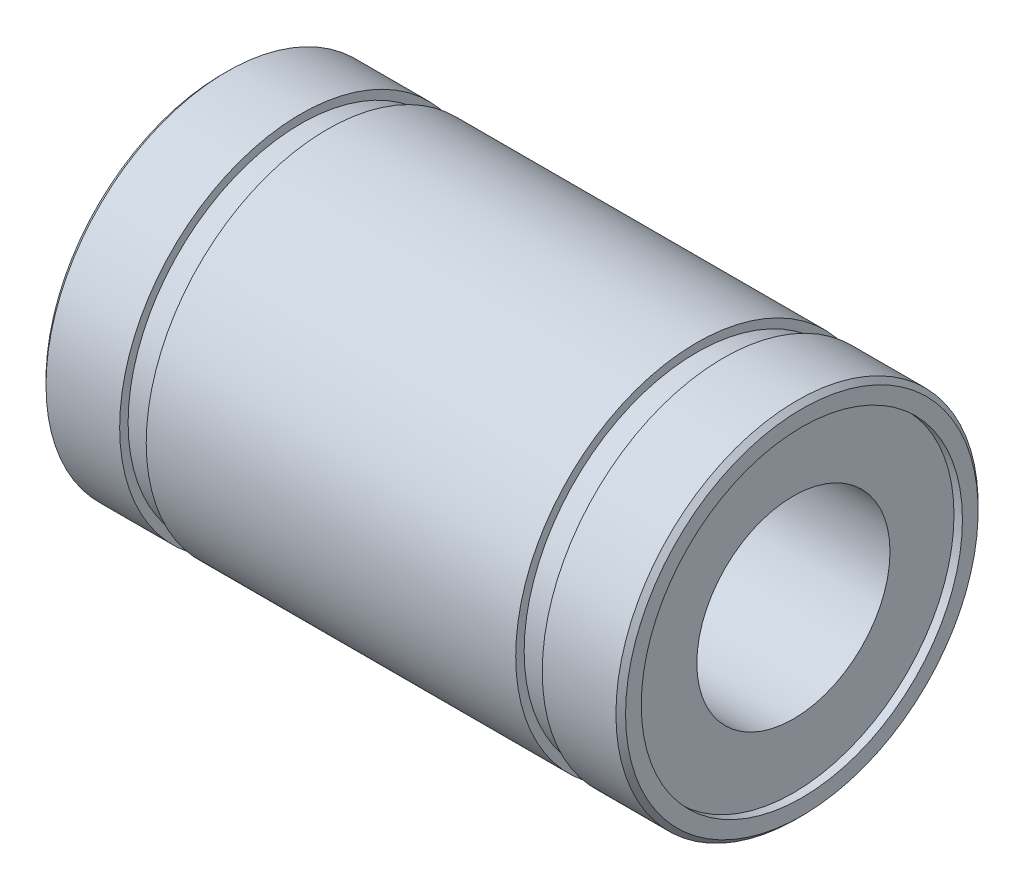
ISO-10303-21;
HEADER;
FILE_DESCRIPTION(('STEP AP214'),'2;1');
FILE_NAME('part.step','',(''),(''),'','','');
FILE_SCHEMA(('AUTOMOTIVE_DESIGN { 1 0 10303 214 1 1 1 1 }'));
ENDSEC;
DATA;
#1=APPLICATION_CONTEXT('core data for automotive mechanical design processes');
#2=APPLICATION_PROTOCOL_DEFINITION('international standard','automotive_design',2000,#1);
#3=PRODUCT_CONTEXT('',#1,'mechanical');
#4=PRODUCT('Part','Part','',(#3));
#5=PRODUCT_RELATED_PRODUCT_CATEGORY('part','',(#4));
#6=PRODUCT_DEFINITION_FORMATION('','',#4);
#7=PRODUCT_DEFINITION_CONTEXT('part definition',#1,'design');
#8=PRODUCT_DEFINITION('design','',#6,#7);
#9=PRODUCT_DEFINITION_SHAPE('','',#8);
#10=(LENGTH_UNIT() NAMED_UNIT(*) SI_UNIT(.MILLI.,.METRE.));
#11=(NAMED_UNIT(*) PLANE_ANGLE_UNIT() SI_UNIT($,.RADIAN.));
#12=(NAMED_UNIT(*) SI_UNIT($,.STERADIAN.) SOLID_ANGLE_UNIT());
#13=UNCERTAINTY_MEASURE_WITH_UNIT(LENGTH_MEASURE(1.E-05),#10,'distance_accuracy_value','');
#14=(GEOMETRIC_REPRESENTATION_CONTEXT(3) GLOBAL_UNCERTAINTY_ASSIGNED_CONTEXT((#13)) GLOBAL_UNIT_ASSIGNED_CONTEXT((#10,
#11,#12)) REPRESENTATION_CONTEXT('',''));
#15=CARTESIAN_POINT('',(0.,0.,0.));
#16=DIRECTION('',(0.,0.,1.));
#17=DIRECTION('',(1.,0.,0.));
#18=AXIS2_PLACEMENT_3D('',#15,#16,#17);
#19=CARTESIAN_POINT('',(0.,0.,0.));
#20=DIRECTION('',(-1.,0.,0.));
#21=DIRECTION('',(0.,0.,1.));
#22=AXIS2_PLACEMENT_3D('',#19,#20,#21);
#23=CYLINDRICAL_SURFACE('',#22,4.);
#24=CARTESIAN_POINT('',(23.65,0.,0.));
#25=DIRECTION('',(-1.,0.,0.));
#26=DIRECTION('',(0.,0.,1.));
#27=AXIS2_PLACEMENT_3D('',#24,#25,#26);
#28=CIRCLE('',#27,4.);
#29=CARTESIAN_POINT('',(23.65,0.,4.));
#30=VERTEX_POINT('',#29);
#31=EDGE_CURVE('E116',#30,#30,#28,.T.);
#32=ORIENTED_EDGE('',*,*,#31,.F.);
#33=EDGE_LOOP('',(#32));
#34=FACE_BOUND('',#33,.T.);
#35=CARTESIAN_POINT('',(0.35,0.,0.));
#36=DIRECTION('',(-1.,0.,0.));
#37=DIRECTION('',(0.,0.,1.));
#38=AXIS2_PLACEMENT_3D('',#35,#36,#37);
#39=CIRCLE('',#38,4.);
#40=CARTESIAN_POINT('',(0.35,0.,4.));
#41=VERTEX_POINT('',#40);
#42=EDGE_CURVE('E66',#41,#41,#39,.T.);
#43=ORIENTED_EDGE('',*,*,#42,.T.);
#44=EDGE_LOOP('',(#43));
#45=FACE_BOUND('',#44,.T.);
#46=ADVANCED_FACE('F38',(#34,#45),#23,.F.);
#47=CARTESIAN_POINT('',(0.35,4.,0.));
#48=DIRECTION('',(1.,0.,0.));
#49=DIRECTION('',(0.,0.,-1.));
#50=AXIS2_PLACEMENT_3D('',#47,#48,#49);
#51=PLANE('',#50);
#52=ORIENTED_EDGE('',*,*,#42,.F.);
#53=EDGE_LOOP('',(#52));
#54=FACE_BOUND('',#53,.T.);
#55=CARTESIAN_POINT('',(0.35,0.,0.));
#56=DIRECTION('',(-1.,0.,0.));
#57=DIRECTION('',(0.,0.,1.));
#58=AXIS2_PLACEMENT_3D('',#55,#56,#57);
#59=CIRCLE('',#58,6.65);
#60=CARTESIAN_POINT('',(0.35,0.,6.65));
#61=VERTEX_POINT('',#60);
#62=EDGE_CURVE('E70',#61,#61,#59,.T.);
#63=ORIENTED_EDGE('',*,*,#62,.T.);
#64=EDGE_LOOP('',(#63));
#65=FACE_BOUND('',#64,.T.);
#66=ADVANCED_FACE('F124',(#54,#65),#51,.F.);
#67=CARTESIAN_POINT('',(0.,0.,0.));
#68=DIRECTION('',(-1.,0.,0.));
#69=DIRECTION('',(0.,0.,1.));
#70=AXIS2_PLACEMENT_3D('',#67,#68,#69);
#71=CYLINDRICAL_SURFACE('',#70,6.65);
#72=ORIENTED_EDGE('',*,*,#62,.F.);
#73=EDGE_LOOP('',(#72));
#74=FACE_BOUND('',#73,.T.);
#75=CARTESIAN_POINT('',(0.,0.,0.));
#76=DIRECTION('',(-1.,0.,0.));
#77=DIRECTION('',(0.,0.,1.));
#78=AXIS2_PLACEMENT_3D('',#75,#76,#77);
#79=CIRCLE('',#78,6.65);
#80=CARTESIAN_POINT('',(0.,0.,6.65));
#81=VERTEX_POINT('',#80);
#82=EDGE_CURVE('E74',#81,#81,#79,.T.);
#83=ORIENTED_EDGE('',*,*,#82,.T.);
#84=EDGE_LOOP('',(#83));
#85=FACE_BOUND('',#84,.T.);
#86=ADVANCED_FACE('F130',(#74,#85),#71,.F.);
#87=CARTESIAN_POINT('',(0.,6.65,0.));
#88=DIRECTION('',(1.,0.,0.));
#89=DIRECTION('',(0.,0.,-1.));
#90=AXIS2_PLACEMENT_3D('',#87,#88,#89);
#91=PLANE('',#90);
#92=CARTESIAN_POINT('',(0.,0.,0.));
#93=DIRECTION('',(1.,0.,0.));
#94=DIRECTION('',(0.,0.,-1.));
#95=AXIS2_PLACEMENT_3D('',#92,#93,#94);
#96=CIRCLE('',#95,7.3);
#97=CARTESIAN_POINT('',(0.,0.,-7.3));
#98=VERTEX_POINT('',#97);
#99=EDGE_CURVE('E47',#98,#98,#96,.F.);
#100=ORIENTED_EDGE('',*,*,#99,.T.);
#101=EDGE_LOOP('',(#100));
#102=FACE_BOUND('',#101,.T.);
#103=ORIENTED_EDGE('',*,*,#82,.F.);
#104=EDGE_LOOP('',(#103));
#105=FACE_BOUND('',#104,.T.);
#106=ADVANCED_FACE('F136',(#102,#105),#91,.F.);
#107=CARTESIAN_POINT('',(0.,0.,0.));
#108=DIRECTION('',(-1.,0.,0.));
#109=DIRECTION('',(0.,0.,1.));
#110=AXIS2_PLACEMENT_3D('',#107,#108,#109);
#111=CYLINDRICAL_SURFACE('',#110,7.5);
#112=CARTESIAN_POINT('',(0.199999999999997,0.,0.));
#113=DIRECTION('',(1.,0.,0.));
#114=DIRECTION('',(0.,0.,-1.));
#115=AXIS2_PLACEMENT_3D('',#112,#113,#114);
#116=CIRCLE('',#115,7.5);
#117=CARTESIAN_POINT('',(0.199999999999997,0.,-7.5));
#118=VERTEX_POINT('',#117);
#119=EDGE_CURVE('E10',#118,#118,#116,.T.);
#120=ORIENTED_EDGE('',*,*,#119,.T.);
#121=EDGE_LOOP('',(#120));
#122=FACE_BOUND('',#121,.T.);
#123=CARTESIAN_POINT('',(3.25,0.,0.));
#124=DIRECTION('',(-1.,0.,0.));
#125=DIRECTION('',(0.,0.,1.));
#126=AXIS2_PLACEMENT_3D('',#123,#124,#125);
#127=CIRCLE('',#126,7.5);
#128=CARTESIAN_POINT('',(3.25,0.,7.5));
#129=VERTEX_POINT('',#128);
#130=EDGE_CURVE('E78',#129,#129,#127,.T.);
#131=ORIENTED_EDGE('',*,*,#130,.T.);
#132=EDGE_LOOP('',(#131));
#133=FACE_BOUND('',#132,.T.);
#134=ADVANCED_FACE('F141',(#122,#133),#111,.T.);
#135=CARTESIAN_POINT('',(3.25,7.5,0.));
#136=DIRECTION('',(-1.,0.,0.));
#137=DIRECTION('',(0.,0.,1.));
#138=AXIS2_PLACEMENT_3D('',#135,#136,#137);
#139=PLANE('',#138);
#140=ORIENTED_EDGE('',*,*,#130,.F.);
#141=EDGE_LOOP('',(#140));
#142=FACE_BOUND('',#141,.T.);
#143=CARTESIAN_POINT('',(3.25,0.,0.));
#144=DIRECTION('',(-1.,0.,0.));
#145=DIRECTION('',(0.,0.,1.));
#146=AXIS2_PLACEMENT_3D('',#143,#144,#145);
#147=CIRCLE('',#146,7.15);
#148=CARTESIAN_POINT('',(3.25,0.,7.15));
#149=VERTEX_POINT('',#148);
#150=EDGE_CURVE('E82',#149,#149,#147,.T.);
#151=ORIENTED_EDGE('',*,*,#150,.T.);
#152=EDGE_LOOP('',(#151));
#153=FACE_BOUND('',#152,.T.);
#154=ADVANCED_FACE('F146',(#142,#153),#139,.F.);
#155=CARTESIAN_POINT('',(0.,0.,0.));
#156=DIRECTION('',(-1.,0.,0.));
#157=DIRECTION('',(0.,0.,1.));
#158=AXIS2_PLACEMENT_3D('',#155,#156,#157);
#159=CYLINDRICAL_SURFACE('',#158,7.15);
#160=ORIENTED_EDGE('',*,*,#150,.F.);
#161=EDGE_LOOP('',(#160));
#162=FACE_BOUND('',#161,.T.);
#163=CARTESIAN_POINT('',(4.35,0.,0.));
#164=DIRECTION('',(-1.,0.,0.));
#165=DIRECTION('',(0.,0.,1.));
#166=AXIS2_PLACEMENT_3D('',#163,#164,#165);
#167=CIRCLE('',#166,7.15);
#168=CARTESIAN_POINT('',(4.35,0.,7.15));
#169=VERTEX_POINT('',#168);
#170=EDGE_CURVE('E86',#169,#169,#167,.T.);
#171=ORIENTED_EDGE('',*,*,#170,.T.);
#172=EDGE_LOOP('',(#171));
#173=FACE_BOUND('',#172,.T.);
#174=ADVANCED_FACE('F198',(#162,#173),#159,.T.);
#175=CARTESIAN_POINT('',(4.35,7.15,0.));
#176=DIRECTION('',(1.,0.,0.));
#177=DIRECTION('',(0.,0.,-1.));
#178=AXIS2_PLACEMENT_3D('',#175,#176,#177);
#179=PLANE('',#178);
#180=ORIENTED_EDGE('',*,*,#170,.F.);
#181=EDGE_LOOP('',(#180));
#182=FACE_BOUND('',#181,.T.);
#183=CARTESIAN_POINT('',(4.35,0.,0.));
#184=DIRECTION('',(-1.,0.,0.));
#185=DIRECTION('',(0.,0.,1.));
#186=AXIS2_PLACEMENT_3D('',#183,#184,#185);
#187=CIRCLE('',#186,7.5);
#188=CARTESIAN_POINT('',(4.35,0.,7.5));
#189=VERTEX_POINT('',#188);
#190=EDGE_CURVE('E90',#189,#189,#187,.T.);
#191=ORIENTED_EDGE('',*,*,#190,.T.);
#192=EDGE_LOOP('',(#191));
#193=FACE_BOUND('',#192,.T.);
#194=ADVANCED_FACE('F194',(#182,#193),#179,.F.);
#195=CARTESIAN_POINT('',(0.,0.,0.));
#196=DIRECTION('',(-1.,0.,0.));
#197=DIRECTION('',(0.,0.,1.));
#198=AXIS2_PLACEMENT_3D('',#195,#196,#197);
#199=CYLINDRICAL_SURFACE('',#198,7.5);
#200=ORIENTED_EDGE('',*,*,#190,.F.);
#201=EDGE_LOOP('',(#200));
#202=FACE_BOUND('',#201,.T.);
#203=CARTESIAN_POINT('',(19.65,0.,0.));
#204=DIRECTION('',(-1.,0.,0.));
#205=DIRECTION('',(0.,0.,1.));
#206=AXIS2_PLACEMENT_3D('',#203,#204,#205);
#207=CIRCLE('',#206,7.5);
#208=CARTESIAN_POINT('',(19.65,0.,7.5));
#209=VERTEX_POINT('',#208);
#210=EDGE_CURVE('E94',#209,#209,#207,.T.);
#211=ORIENTED_EDGE('',*,*,#210,.T.);
#212=EDGE_LOOP('',(#211));
#213=FACE_BOUND('',#212,.T.);
#214=ADVANCED_FACE('F190',(#202,#213),#199,.T.);
#215=CARTESIAN_POINT('',(19.65,7.5,0.));
#216=DIRECTION('',(-1.,0.,0.));
#217=DIRECTION('',(0.,0.,1.));
#218=AXIS2_PLACEMENT_3D('',#215,#216,#217);
#219=PLANE('',#218);
#220=ORIENTED_EDGE('',*,*,#210,.F.);
#221=EDGE_LOOP('',(#220));
#222=FACE_BOUND('',#221,.T.);
#223=CARTESIAN_POINT('',(19.65,0.,0.));
#224=DIRECTION('',(-1.,0.,0.));
#225=DIRECTION('',(0.,0.,1.));
#226=AXIS2_PLACEMENT_3D('',#223,#224,#225);
#227=CIRCLE('',#226,7.15);
#228=CARTESIAN_POINT('',(19.65,0.,7.15));
#229=VERTEX_POINT('',#228);
#230=EDGE_CURVE('E98',#229,#229,#227,.T.);
#231=ORIENTED_EDGE('',*,*,#230,.T.);
#232=EDGE_LOOP('',(#231));
#233=FACE_BOUND('',#232,.T.);
#234=ADVANCED_FACE('F182',(#222,#233),#219,.F.);
#235=CARTESIAN_POINT('',(0.,0.,0.));
#236=DIRECTION('',(-1.,0.,0.));
#237=DIRECTION('',(0.,0.,1.));
#238=AXIS2_PLACEMENT_3D('',#235,#236,#237);
#239=CYLINDRICAL_SURFACE('',#238,7.15);
#240=ORIENTED_EDGE('',*,*,#230,.F.);
#241=EDGE_LOOP('',(#240));
#242=FACE_BOUND('',#241,.T.);
#243=CARTESIAN_POINT('',(20.75,0.,0.));
#244=DIRECTION('',(-1.,0.,0.));
#245=DIRECTION('',(0.,0.,1.));
#246=AXIS2_PLACEMENT_3D('',#243,#244,#245);
#247=CIRCLE('',#246,7.15);
#248=CARTESIAN_POINT('',(20.75,0.,7.15));
#249=VERTEX_POINT('',#248);
#250=EDGE_CURVE('E101',#249,#249,#247,.T.);
#251=ORIENTED_EDGE('',*,*,#250,.T.);
#252=EDGE_LOOP('',(#251));
#253=FACE_BOUND('',#252,.T.);
#254=ADVANCED_FACE('F176',(#242,#253),#239,.T.);
#255=CARTESIAN_POINT('',(20.75,7.15,0.));
#256=DIRECTION('',(1.,0.,0.));
#257=DIRECTION('',(0.,0.,-1.));
#258=AXIS2_PLACEMENT_3D('',#255,#256,#257);
#259=PLANE('',#258);
#260=ORIENTED_EDGE('',*,*,#250,.F.);
#261=EDGE_LOOP('',(#260));
#262=FACE_BOUND('',#261,.T.);
#263=CARTESIAN_POINT('',(20.75,0.,0.));
#264=DIRECTION('',(-1.,0.,0.));
#265=DIRECTION('',(0.,0.,1.));
#266=AXIS2_PLACEMENT_3D('',#263,#264,#265);
#267=CIRCLE('',#266,7.5);
#268=CARTESIAN_POINT('',(20.75,0.,7.5));
#269=VERTEX_POINT('',#268);
#270=EDGE_CURVE('E105',#269,#269,#267,.T.);
#271=ORIENTED_EDGE('',*,*,#270,.T.);
#272=EDGE_LOOP('',(#271));
#273=FACE_BOUND('',#272,.T.);
#274=ADVANCED_FACE('F171',(#262,#273),#259,.F.);
#275=CARTESIAN_POINT('',(0.,0.,0.));
#276=DIRECTION('',(-1.,0.,0.));
#277=DIRECTION('',(0.,0.,1.));
#278=AXIS2_PLACEMENT_3D('',#275,#276,#277);
#279=CYLINDRICAL_SURFACE('',#278,7.5);
#280=CARTESIAN_POINT('',(23.8,0.,0.));
#281=DIRECTION('',(-1.,0.,0.));
#282=DIRECTION('',(0.,0.,1.));
#283=AXIS2_PLACEMENT_3D('',#280,#281,#282);
#284=CIRCLE('',#283,7.5);
#285=CARTESIAN_POINT('',(23.8,0.,7.5));
#286=VERTEX_POINT('',#285);
#287=EDGE_CURVE('E60',#286,#286,#284,.T.);
#288=ORIENTED_EDGE('',*,*,#287,.T.);
#289=EDGE_LOOP('',(#288));
#290=FACE_BOUND('',#289,.T.);
#291=ORIENTED_EDGE('',*,*,#270,.F.);
#292=EDGE_LOOP('',(#291));
#293=FACE_BOUND('',#292,.T.);
#294=ADVANCED_FACE('F167',(#290,#293),#279,.T.);
#295=CARTESIAN_POINT('',(24.,7.5,0.));
#296=DIRECTION('',(-1.,0.,0.));
#297=DIRECTION('',(0.,0.,1.));
#298=AXIS2_PLACEMENT_3D('',#295,#296,#297);
#299=PLANE('',#298);
#300=CARTESIAN_POINT('',(24.,0.,0.));
#301=DIRECTION('',(-1.,0.,0.));
#302=DIRECTION('',(0.,0.,1.));
#303=AXIS2_PLACEMENT_3D('',#300,#301,#302);
#304=CIRCLE('',#303,7.29999999999999);
#305=CARTESIAN_POINT('',(24.,0.,7.29999999999999));
#306=VERTEX_POINT('',#305);
#307=EDGE_CURVE('E53',#306,#306,#304,.F.);
#308=ORIENTED_EDGE('',*,*,#307,.T.);
#309=EDGE_LOOP('',(#308));
#310=FACE_BOUND('',#309,.T.);
#311=CARTESIAN_POINT('',(24.,0.,0.));
#312=DIRECTION('',(-1.,0.,0.));
#313=DIRECTION('',(0.,0.,1.));
#314=AXIS2_PLACEMENT_3D('',#311,#312,#313);
#315=CIRCLE('',#314,6.65);
#316=CARTESIAN_POINT('',(24.,0.,6.65));
#317=VERTEX_POINT('',#316);
#318=EDGE_CURVE('E109',#317,#317,#315,.T.);
#319=ORIENTED_EDGE('',*,*,#318,.T.);
#320=EDGE_LOOP('',(#319));
#321=FACE_BOUND('',#320,.T.);
#322=ADVANCED_FACE('F170',(#310,#321),#299,.F.);
#323=CARTESIAN_POINT('',(0.,0.,0.));
#324=DIRECTION('',(-1.,0.,0.));
#325=DIRECTION('',(0.,0.,1.));
#326=AXIS2_PLACEMENT_3D('',#323,#324,#325);
#327=CYLINDRICAL_SURFACE('',#326,6.65);
#328=ORIENTED_EDGE('',*,*,#318,.F.);
#329=EDGE_LOOP('',(#328));
#330=FACE_BOUND('',#329,.T.);
#331=CARTESIAN_POINT('',(23.65,0.,0.));
#332=DIRECTION('',(-1.,0.,0.));
#333=DIRECTION('',(0.,0.,1.));
#334=AXIS2_PLACEMENT_3D('',#331,#332,#333);
#335=CIRCLE('',#334,6.65);
#336=CARTESIAN_POINT('',(23.65,0.,6.65));
#337=VERTEX_POINT('',#336);
#338=EDGE_CURVE('E112',#337,#337,#335,.T.);
#339=ORIENTED_EDGE('',*,*,#338,.T.);
#340=EDGE_LOOP('',(#339));
#341=FACE_BOUND('',#340,.T.);
#342=ADVANCED_FACE('F160',(#330,#341),#327,.F.);
#343=CARTESIAN_POINT('',(23.65,6.65,0.));
#344=DIRECTION('',(-1.,0.,0.));
#345=DIRECTION('',(0.,0.,1.));
#346=AXIS2_PLACEMENT_3D('',#343,#344,#345);
#347=PLANE('',#346);
#348=ORIENTED_EDGE('',*,*,#338,.F.);
#349=EDGE_LOOP('',(#348));
#350=FACE_BOUND('',#349,.T.);
#351=ORIENTED_EDGE('',*,*,#31,.T.);
#352=EDGE_LOOP('',(#351));
#353=FACE_BOUND('',#352,.T.);
#354=ADVANCED_FACE('F120',(#350,#353),#347,.F.);
#355=CARTESIAN_POINT('',(23.8,0.,0.));
#356=DIRECTION('',(-1.,0.,0.));
#357=DIRECTION('',(0.,0.,1.));
#358=AXIS2_PLACEMENT_3D('',#355,#356,#357);
#359=CONICAL_SURFACE('',#358,7.5,0.785398163397459);
#360=ORIENTED_EDGE('',*,*,#307,.F.);
#361=EDGE_LOOP('',(#360));
#362=FACE_BOUND('',#361,.T.);
#363=ORIENTED_EDGE('',*,*,#287,.F.);
#364=EDGE_LOOP('',(#363));
#365=FACE_BOUND('',#364,.T.);
#366=ADVANCED_FACE('F150',(#362,#365),#359,.T.);
#367=CARTESIAN_POINT('',(0.,0.,0.));
#368=DIRECTION('',(1.,0.,0.));
#369=DIRECTION('',(0.,0.,-1.));
#370=AXIS2_PLACEMENT_3D('',#367,#368,#369);
#371=CONICAL_SURFACE('',#370,7.3,0.785398163397444);
#372=ORIENTED_EDGE('',*,*,#119,.F.);
#373=EDGE_LOOP('',(#372));
#374=FACE_BOUND('',#373,.T.);
#375=ORIENTED_EDGE('',*,*,#99,.F.);
#376=EDGE_LOOP('',(#375));
#377=FACE_BOUND('',#376,.T.);
#378=ADVANCED_FACE('F41',(#374,#377),#371,.T.);
#379=CLOSED_SHELL('',(#46,#66,#86,#106,#134,#154,#174,#194,#214,#234,#254,#274,#294,#322,#342,
#354,#366,#378));
#380=MANIFOLD_SOLID_BREP('B2',#379);
#381=ADVANCED_BREP_SHAPE_REPRESENTATION('',(#18,#380),#14);
#382=SHAPE_DEFINITION_REPRESENTATION(#9,#381);
ENDSEC;
END-ISO-10303-21;
